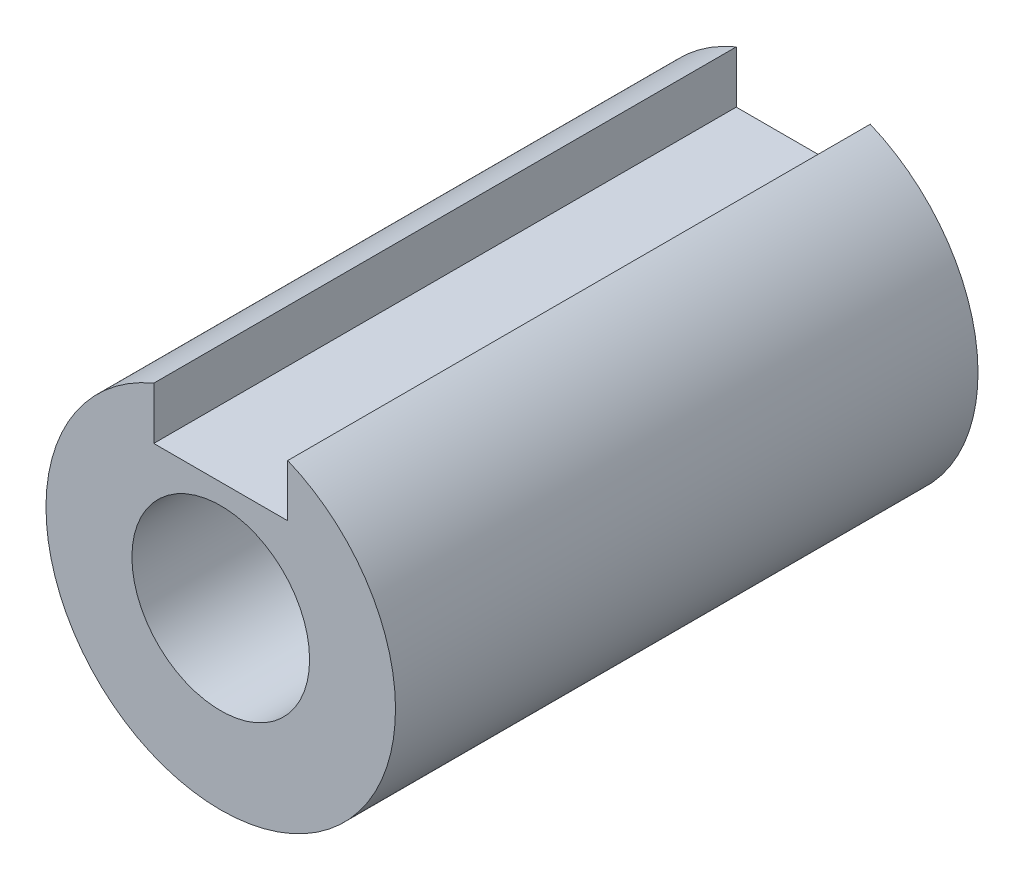
ISO-10303-21;
HEADER;
FILE_DESCRIPTION(('STEP AP214'),'2;1');
FILE_NAME('part.step','',(''),(''),'','','');
FILE_SCHEMA(('AUTOMOTIVE_DESIGN { 1 0 10303 214 1 1 1 1 }'));
ENDSEC;
DATA;
#1=APPLICATION_CONTEXT('core data for automotive mechanical design processes');
#2=APPLICATION_PROTOCOL_DEFINITION('international standard','automotive_design',2000,#1);
#3=PRODUCT_CONTEXT('',#1,'mechanical');
#4=PRODUCT('Part','Part','',(#3));
#5=PRODUCT_RELATED_PRODUCT_CATEGORY('part','',(#4));
#6=PRODUCT_DEFINITION_FORMATION('','',#4);
#7=PRODUCT_DEFINITION_CONTEXT('part definition',#1,'design');
#8=PRODUCT_DEFINITION('design','',#6,#7);
#9=PRODUCT_DEFINITION_SHAPE('','',#8);
#10=(LENGTH_UNIT() NAMED_UNIT(*) SI_UNIT(.MILLI.,.METRE.));
#11=(NAMED_UNIT(*) PLANE_ANGLE_UNIT() SI_UNIT($,.RADIAN.));
#12=(NAMED_UNIT(*) SI_UNIT($,.STERADIAN.) SOLID_ANGLE_UNIT());
#13=UNCERTAINTY_MEASURE_WITH_UNIT(LENGTH_MEASURE(1.E-05),#10,'distance_accuracy_value','');
#14=(GEOMETRIC_REPRESENTATION_CONTEXT(3) GLOBAL_UNCERTAINTY_ASSIGNED_CONTEXT((#13)) GLOBAL_UNIT_ASSIGNED_CONTEXT((#10,
#11,#12)) REPRESENTATION_CONTEXT('',''));
#15=CARTESIAN_POINT('',(0.,0.,0.));
#16=DIRECTION('',(0.,0.,1.));
#17=DIRECTION('',(1.,0.,0.));
#18=AXIS2_PLACEMENT_3D('',#15,#16,#17);
#19=CARTESIAN_POINT('',(0.,0.,20.));
#20=DIRECTION('',(0.,0.,1.));
#21=DIRECTION('',(1.,0.,0.));
#22=AXIS2_PLACEMENT_3D('',#19,#20,#21);
#23=CYLINDRICAL_SURFACE('',#22,3.05);
#24=CARTESIAN_POINT('',(0.,0.,40.));
#25=DIRECTION('',(0.,0.,1.));
#26=DIRECTION('',(1.,0.,0.));
#27=AXIS2_PLACEMENT_3D('',#24,#25,#26);
#28=CIRCLE('',#27,3.05);
#29=CARTESIAN_POINT('',(3.05,0.,40.));
#30=VERTEX_POINT('',#29);
#31=EDGE_CURVE('E9',#30,#30,#28,.T.);
#32=ORIENTED_EDGE('',*,*,#31,.T.);
#33=EDGE_LOOP('',(#32));
#34=FACE_BOUND('',#33,.T.);
#35=CARTESIAN_POINT('',(0.,0.,23.));
#36=DIRECTION('',(0.,0.,1.));
#37=DIRECTION('',(1.,0.,0.));
#38=AXIS2_PLACEMENT_3D('',#35,#36,#37);
#39=CIRCLE('',#38,3.05);
#40=CARTESIAN_POINT('',(3.05,0.,23.));
#41=VERTEX_POINT('',#40);
#42=EDGE_CURVE('E77',#41,#41,#39,.T.);
#43=ORIENTED_EDGE('',*,*,#42,.F.);
#44=EDGE_LOOP('',(#43));
#45=FACE_BOUND('',#44,.T.);
#46=ADVANCED_FACE('F15',(#34,#45),#23,.F.);
#47=CARTESIAN_POINT('',(0.,0.,20.));
#48=DIRECTION('',(0.,0.,-1.));
#49=DIRECTION('',(-1.,0.,0.));
#50=AXIS2_PLACEMENT_3D('',#47,#48,#49);
#51=PLANE('',#50);
#52=DIRECTION('',(0.,1.,0.));
#53=VECTOR('',#52,1.);
#54=CARTESIAN_POINT('',(2.3,3.75,20.));
#55=LINE('',#54,#53);
#56=CARTESIAN_POINT('',(2.3,3.75,20.));
#57=VERTEX_POINT('',#56);
#58=CARTESIAN_POINT('',(2.3,5.54166040099896,20.));
#59=VERTEX_POINT('',#58);
#60=EDGE_CURVE('E25',#57,#59,#55,.T.);
#61=ORIENTED_EDGE('',*,*,#60,.T.);
#62=CARTESIAN_POINT('',(0.,0.,20.));
#63=DIRECTION('',(0.,0.,1.));
#64=DIRECTION('',(1.,0.,0.));
#65=AXIS2_PLACEMENT_3D('',#62,#63,#64);
#66=CIRCLE('',#65,6.);
#67=CARTESIAN_POINT('',(-2.3,5.54166040099896,20.));
#68=VERTEX_POINT('',#67);
#69=EDGE_CURVE('E34',#68,#59,#66,.T.);
#70=ORIENTED_EDGE('',*,*,#69,.F.);
#71=DIRECTION('',(0.,-1.,0.));
#72=VECTOR('',#71,1.);
#73=CARTESIAN_POINT('',(-2.3,5.54166040099896,20.));
#74=LINE('',#73,#72);
#75=CARTESIAN_POINT('',(-2.3,3.75,20.));
#76=VERTEX_POINT('',#75);
#77=EDGE_CURVE('E86',#68,#76,#74,.T.);
#78=ORIENTED_EDGE('',*,*,#77,.T.);
#79=DIRECTION('',(1.,0.,0.));
#80=VECTOR('',#79,1.);
#81=CARTESIAN_POINT('',(-2.3,3.75,20.));
#82=LINE('',#81,#80);
#83=EDGE_CURVE('E71',#76,#57,#82,.T.);
#84=ORIENTED_EDGE('',*,*,#83,.T.);
#85=EDGE_LOOP('',(#61,#70,#78,#84));
#86=FACE_BOUND('',#85,.T.);
#87=ADVANCED_FACE('F99',(#86),#51,.T.);
#88=CARTESIAN_POINT('',(0.,0.,40.));
#89=DIRECTION('',(0.,0.,-1.));
#90=DIRECTION('',(-1.,0.,0.));
#91=AXIS2_PLACEMENT_3D('',#88,#89,#90);
#92=PLANE('',#91);
#93=DIRECTION('',(1.,0.,0.));
#94=VECTOR('',#93,1.);
#95=CARTESIAN_POINT('',(-2.3,3.75,40.));
#96=LINE('',#95,#94);
#97=CARTESIAN_POINT('',(-2.3,3.75,40.));
#98=VERTEX_POINT('',#97);
#99=CARTESIAN_POINT('',(2.3,3.75,40.));
#100=VERTEX_POINT('',#99);
#101=EDGE_CURVE('E76',#98,#100,#96,.T.);
#102=ORIENTED_EDGE('',*,*,#101,.F.);
#103=DIRECTION('',(0.,-1.,0.));
#104=VECTOR('',#103,1.);
#105=CARTESIAN_POINT('',(-2.3,5.54166040099896,40.));
#106=LINE('',#105,#104);
#107=CARTESIAN_POINT('',(-2.3,5.54166040099896,40.));
#108=VERTEX_POINT('',#107);
#109=EDGE_CURVE('E53',#108,#98,#106,.T.);
#110=ORIENTED_EDGE('',*,*,#109,.F.);
#111=CARTESIAN_POINT('',(0.,0.,40.));
#112=DIRECTION('',(0.,0.,1.));
#113=DIRECTION('',(1.,0.,0.));
#114=AXIS2_PLACEMENT_3D('',#111,#112,#113);
#115=CIRCLE('',#114,6.);
#116=CARTESIAN_POINT('',(2.3,5.54166040099896,40.));
#117=VERTEX_POINT('',#116);
#118=EDGE_CURVE('E67',#108,#117,#115,.T.);
#119=ORIENTED_EDGE('',*,*,#118,.T.);
#120=DIRECTION('',(0.,1.,0.));
#121=VECTOR('',#120,1.);
#122=CARTESIAN_POINT('',(2.3,3.75,40.));
#123=LINE('',#122,#121);
#124=EDGE_CURVE('E60',#100,#117,#123,.T.);
#125=ORIENTED_EDGE('',*,*,#124,.F.);
#126=EDGE_LOOP('',(#102,#110,#119,#125));
#127=FACE_BOUND('',#126,.T.);
#128=ORIENTED_EDGE('',*,*,#31,.F.);
#129=EDGE_LOOP('',(#128));
#130=FACE_BOUND('',#129,.T.);
#131=ADVANCED_FACE('F68',(#127,#130),#92,.F.);
#132=CARTESIAN_POINT('',(0.,0.,20.));
#133=DIRECTION('',(0.,0.,1.));
#134=DIRECTION('',(1.,0.,0.));
#135=AXIS2_PLACEMENT_3D('',#132,#133,#134);
#136=CYLINDRICAL_SURFACE('',#135,6.);
#137=ORIENTED_EDGE('',*,*,#118,.F.);
#138=DIRECTION('',(0.,0.,1.));
#139=VECTOR('',#138,1.);
#140=CARTESIAN_POINT('',(-2.3,5.54166040099896,20.));
#141=LINE('',#140,#139);
#142=EDGE_CURVE('E73',#68,#108,#141,.T.);
#143=ORIENTED_EDGE('',*,*,#142,.F.);
#144=ORIENTED_EDGE('',*,*,#69,.T.);
#145=DIRECTION('',(0.,0.,-1.));
#146=VECTOR('',#145,1.);
#147=CARTESIAN_POINT('',(2.3,5.54166040099896,20.));
#148=LINE('',#147,#146);
#149=EDGE_CURVE('E63',#117,#59,#148,.T.);
#150=ORIENTED_EDGE('',*,*,#149,.F.);
#151=EDGE_LOOP('',(#137,#143,#144,#150));
#152=FACE_BOUND('',#151,.T.);
#153=ADVANCED_FACE('F17',(#152),#136,.T.);
#154=CARTESIAN_POINT('',(2.3,6.29316109321346,40.));
#155=DIRECTION('',(1.,0.,0.));
#156=DIRECTION('',(0.,0.,-1.));
#157=AXIS2_PLACEMENT_3D('',#154,#155,#156);
#158=PLANE('',#157);
#159=ORIENTED_EDGE('',*,*,#124,.T.);
#160=ORIENTED_EDGE('',*,*,#149,.T.);
#161=ORIENTED_EDGE('',*,*,#60,.F.);
#162=DIRECTION('',(0.,0.,-1.));
#163=VECTOR('',#162,1.);
#164=CARTESIAN_POINT('',(2.3,3.75,40.));
#165=LINE('',#164,#163);
#166=EDGE_CURVE('E65',#100,#57,#165,.T.);
#167=ORIENTED_EDGE('',*,*,#166,.F.);
#168=EDGE_LOOP('',(#159,#160,#161,#167));
#169=FACE_BOUND('',#168,.T.);
#170=ADVANCED_FACE('F61',(#169),#158,.F.);
#171=CARTESIAN_POINT('',(-2.3,6.29316109321346,40.));
#172=DIRECTION('',(-1.,0.,0.));
#173=DIRECTION('',(0.,0.,1.));
#174=AXIS2_PLACEMENT_3D('',#171,#172,#173);
#175=PLANE('',#174);
#176=ORIENTED_EDGE('',*,*,#77,.F.);
#177=ORIENTED_EDGE('',*,*,#142,.T.);
#178=ORIENTED_EDGE('',*,*,#109,.T.);
#179=DIRECTION('',(0.,0.,-1.));
#180=VECTOR('',#179,1.);
#181=CARTESIAN_POINT('',(-2.3,3.75,40.));
#182=LINE('',#181,#180);
#183=EDGE_CURVE('E19',#98,#76,#182,.T.);
#184=ORIENTED_EDGE('',*,*,#183,.T.);
#185=EDGE_LOOP('',(#176,#177,#178,#184));
#186=FACE_BOUND('',#185,.T.);
#187=ADVANCED_FACE('F96',(#186),#175,.F.);
#188=CARTESIAN_POINT('',(2.3,3.75,40.));
#189=DIRECTION('',(0.,-1.,0.));
#190=DIRECTION('',(1.,0.,0.));
#191=AXIS2_PLACEMENT_3D('',#188,#189,#190);
#192=PLANE('',#191);
#193=ORIENTED_EDGE('',*,*,#83,.F.);
#194=ORIENTED_EDGE('',*,*,#183,.F.);
#195=ORIENTED_EDGE('',*,*,#101,.T.);
#196=ORIENTED_EDGE('',*,*,#166,.T.);
#197=EDGE_LOOP('',(#193,#194,#195,#196));
#198=FACE_BOUND('',#197,.T.);
#199=ADVANCED_FACE('F97',(#198),#192,.F.);
#200=CARTESIAN_POINT('',(0.,0.,23.));
#201=DIRECTION('',(0.,0.,-1.));
#202=DIRECTION('',(-1.,0.,0.));
#203=AXIS2_PLACEMENT_3D('',#200,#201,#202);
#204=PLANE('',#203);
#205=ORIENTED_EDGE('',*,*,#42,.T.);
#206=EDGE_LOOP('',(#205));
#207=FACE_BOUND('',#206,.T.);
#208=ADVANCED_FACE('F116',(#207),#204,.F.);
#209=CLOSED_SHELL('',(#46,#87,#131,#153,#170,#187,#199,#208));
#210=MANIFOLD_SOLID_BREP('B1',#209);
#211=ADVANCED_BREP_SHAPE_REPRESENTATION('',(#18,#210),#14);
#212=SHAPE_DEFINITION_REPRESENTATION(#9,#211);
ENDSEC;
END-ISO-10303-21;
